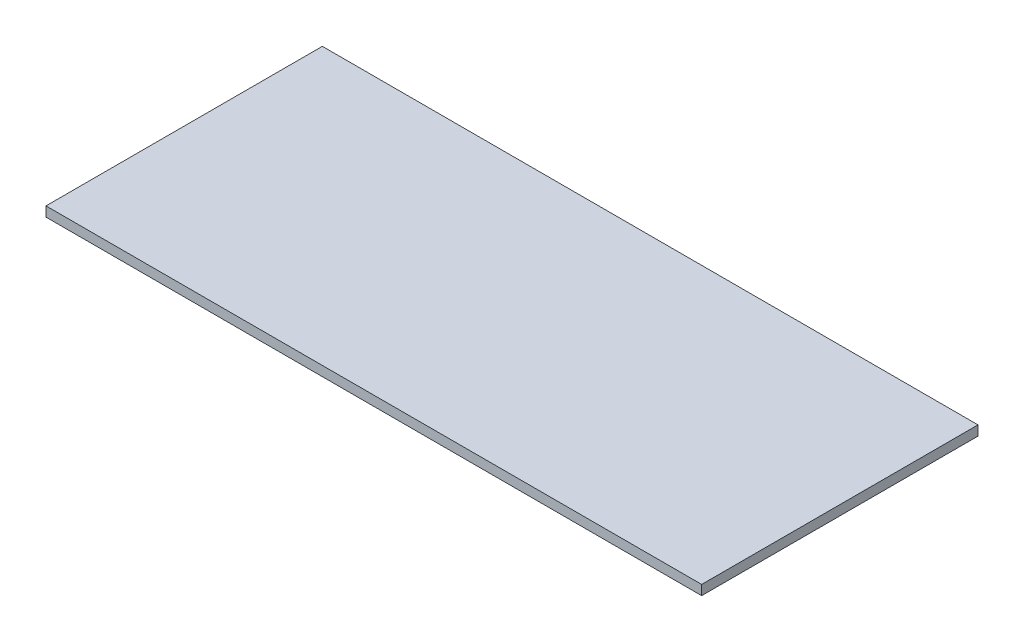
ISO-10303-21;
HEADER;
FILE_DESCRIPTION(('STEP AP214'),'2;1');
FILE_NAME('part.step','',(''),(''),'','','');
FILE_SCHEMA(('AUTOMOTIVE_DESIGN { 1 0 10303 214 1 1 1 1 }'));
ENDSEC;
DATA;
#1=APPLICATION_CONTEXT('core data for automotive mechanical design processes');
#2=APPLICATION_PROTOCOL_DEFINITION('international standard','automotive_design',2000,#1);
#3=PRODUCT_CONTEXT('',#1,'mechanical');
#4=PRODUCT('Part','Part','',(#3));
#5=PRODUCT_RELATED_PRODUCT_CATEGORY('part','',(#4));
#6=PRODUCT_DEFINITION_FORMATION('','',#4);
#7=PRODUCT_DEFINITION_CONTEXT('part definition',#1,'design');
#8=PRODUCT_DEFINITION('design','',#6,#7);
#9=PRODUCT_DEFINITION_SHAPE('','',#8);
#10=(LENGTH_UNIT() NAMED_UNIT(*) SI_UNIT(.MILLI.,.METRE.));
#11=(NAMED_UNIT(*) PLANE_ANGLE_UNIT() SI_UNIT($,.RADIAN.));
#12=(NAMED_UNIT(*) SI_UNIT($,.STERADIAN.) SOLID_ANGLE_UNIT());
#13=UNCERTAINTY_MEASURE_WITH_UNIT(LENGTH_MEASURE(1.E-05),#10,'distance_accuracy_value','');
#14=(GEOMETRIC_REPRESENTATION_CONTEXT(3) GLOBAL_UNCERTAINTY_ASSIGNED_CONTEXT((#13)) GLOBAL_UNIT_ASSIGNED_CONTEXT((#10,
#11,#12)) REPRESENTATION_CONTEXT('',''));
#15=CARTESIAN_POINT('',(0.,0.,0.));
#16=DIRECTION('',(0.,0.,1.));
#17=DIRECTION('',(1.,0.,0.));
#18=AXIS2_PLACEMENT_3D('',#15,#16,#17);
#19=CARTESIAN_POINT('',(-605.,18.,-255.));
#20=DIRECTION('',(0.,0.,-1.));
#21=DIRECTION('',(-1.,0.,0.));
#22=AXIS2_PLACEMENT_3D('',#19,#20,#21);
#23=PLANE('',#22);
#24=DIRECTION('',(1.,0.,0.));
#25=VECTOR('',#24,1.);
#26=CARTESIAN_POINT('',(-605.,0.,-255.));
#27=LINE('',#26,#25);
#28=CARTESIAN_POINT('',(-605.,0.,-255.));
#29=VERTEX_POINT('',#28);
#30=CARTESIAN_POINT('',(605.,0.,-255.));
#31=VERTEX_POINT('',#30);
#32=EDGE_CURVE('E97',#29,#31,#27,.T.);
#33=ORIENTED_EDGE('',*,*,#32,.F.);
#34=DIRECTION('',(0.,-1.,0.));
#35=VECTOR('',#34,1.);
#36=CARTESIAN_POINT('',(-605.,18.,-255.));
#37=LINE('',#36,#35);
#38=CARTESIAN_POINT('',(-605.,18.,-255.));
#39=VERTEX_POINT('',#38);
#40=EDGE_CURVE('E11',#39,#29,#37,.T.);
#41=ORIENTED_EDGE('',*,*,#40,.F.);
#42=DIRECTION('',(1.,0.,0.));
#43=VECTOR('',#42,1.);
#44=CARTESIAN_POINT('',(-605.,18.,-255.));
#45=LINE('',#44,#43);
#46=CARTESIAN_POINT('',(605.,18.,-255.));
#47=VERTEX_POINT('',#46);
#48=EDGE_CURVE('E92',#39,#47,#45,.T.);
#49=ORIENTED_EDGE('',*,*,#48,.T.);
#50=DIRECTION('',(0.,-1.,0.));
#51=VECTOR('',#50,1.);
#52=CARTESIAN_POINT('',(605.,18.,-255.));
#53=LINE('',#52,#51);
#54=EDGE_CURVE('E35',#47,#31,#53,.T.);
#55=ORIENTED_EDGE('',*,*,#54,.T.);
#56=EDGE_LOOP('',(#33,#41,#49,#55));
#57=FACE_BOUND('',#56,.T.);
#58=ADVANCED_FACE('F32',(#57),#23,.T.);
#59=CARTESIAN_POINT('',(-605.,18.,-255.));
#60=DIRECTION('',(1.,0.,0.));
#61=DIRECTION('',(0.,0.,-1.));
#62=AXIS2_PLACEMENT_3D('',#59,#60,#61);
#63=PLANE('',#62);
#64=DIRECTION('',(0.,0.,1.));
#65=VECTOR('',#64,1.);
#66=CARTESIAN_POINT('',(-605.,0.,-255.));
#67=LINE('',#66,#65);
#68=CARTESIAN_POINT('',(-605.,0.,255.));
#69=VERTEX_POINT('',#68);
#70=EDGE_CURVE('E65',#29,#69,#67,.T.);
#71=ORIENTED_EDGE('',*,*,#70,.T.);
#72=DIRECTION('',(0.,-1.,0.));
#73=VECTOR('',#72,1.);
#74=CARTESIAN_POINT('',(-605.,18.,255.));
#75=LINE('',#74,#73);
#76=CARTESIAN_POINT('',(-605.,18.,255.));
#77=VERTEX_POINT('',#76);
#78=EDGE_CURVE('E41',#77,#69,#75,.T.);
#79=ORIENTED_EDGE('',*,*,#78,.F.);
#80=DIRECTION('',(0.,0.,1.));
#81=VECTOR('',#80,1.);
#82=CARTESIAN_POINT('',(-605.,18.,-255.));
#83=LINE('',#82,#81);
#84=EDGE_CURVE('E82',#39,#77,#83,.T.);
#85=ORIENTED_EDGE('',*,*,#84,.F.);
#86=ORIENTED_EDGE('',*,*,#40,.T.);
#87=EDGE_LOOP('',(#71,#79,#85,#86));
#88=FACE_BOUND('',#87,.T.);
#89=ADVANCED_FACE('F107',(#88),#63,.F.);
#90=CARTESIAN_POINT('',(-605.,18.,255.));
#91=DIRECTION('',(0.,0.,-1.));
#92=DIRECTION('',(-1.,0.,0.));
#93=AXIS2_PLACEMENT_3D('',#90,#91,#92);
#94=PLANE('',#93);
#95=DIRECTION('',(1.,0.,0.));
#96=VECTOR('',#95,1.);
#97=CARTESIAN_POINT('',(-605.,0.,255.));
#98=LINE('',#97,#96);
#99=CARTESIAN_POINT('',(605.,0.,255.));
#100=VERTEX_POINT('',#99);
#101=EDGE_CURVE('E89',#69,#100,#98,.T.);
#102=ORIENTED_EDGE('',*,*,#101,.T.);
#103=DIRECTION('',(0.,-1.,0.));
#104=VECTOR('',#103,1.);
#105=CARTESIAN_POINT('',(605.,18.,255.));
#106=LINE('',#105,#104);
#107=CARTESIAN_POINT('',(605.,18.,255.));
#108=VERTEX_POINT('',#107);
#109=EDGE_CURVE('E86',#108,#100,#106,.T.);
#110=ORIENTED_EDGE('',*,*,#109,.F.);
#111=DIRECTION('',(1.,0.,0.));
#112=VECTOR('',#111,1.);
#113=CARTESIAN_POINT('',(-605.,18.,255.));
#114=LINE('',#113,#112);
#115=EDGE_CURVE('E77',#77,#108,#114,.T.);
#116=ORIENTED_EDGE('',*,*,#115,.F.);
#117=ORIENTED_EDGE('',*,*,#78,.T.);
#118=EDGE_LOOP('',(#102,#110,#116,#117));
#119=FACE_BOUND('',#118,.T.);
#120=ADVANCED_FACE('F87',(#119),#94,.F.);
#121=CARTESIAN_POINT('',(605.,18.,-255.));
#122=DIRECTION('',(1.,0.,0.));
#123=DIRECTION('',(0.,0.,-1.));
#124=AXIS2_PLACEMENT_3D('',#121,#122,#123);
#125=PLANE('',#124);
#126=DIRECTION('',(0.,0.,1.));
#127=VECTOR('',#126,1.);
#128=CARTESIAN_POINT('',(605.,0.,-255.));
#129=LINE('',#128,#127);
#130=EDGE_CURVE('E100',#31,#100,#129,.T.);
#131=ORIENTED_EDGE('',*,*,#130,.F.);
#132=ORIENTED_EDGE('',*,*,#54,.F.);
#133=DIRECTION('',(0.,0.,1.));
#134=VECTOR('',#133,1.);
#135=CARTESIAN_POINT('',(605.,18.,-255.));
#136=LINE('',#135,#134);
#137=EDGE_CURVE('E81',#47,#108,#136,.T.);
#138=ORIENTED_EDGE('',*,*,#137,.T.);
#139=ORIENTED_EDGE('',*,*,#109,.T.);
#140=EDGE_LOOP('',(#131,#132,#138,#139));
#141=FACE_BOUND('',#140,.T.);
#142=ADVANCED_FACE('F91',(#141),#125,.T.);
#143=CARTESIAN_POINT('',(0.,18.,0.));
#144=DIRECTION('',(0.,-1.,0.));
#145=DIRECTION('',(0.,0.,-1.));
#146=AXIS2_PLACEMENT_3D('',#143,#144,#145);
#147=PLANE('',#146);
#148=ORIENTED_EDGE('',*,*,#48,.F.);
#149=ORIENTED_EDGE('',*,*,#84,.T.);
#150=ORIENTED_EDGE('',*,*,#115,.T.);
#151=ORIENTED_EDGE('',*,*,#137,.F.);
#152=EDGE_LOOP('',(#148,#149,#150,#151));
#153=FACE_BOUND('',#152,.T.);
#154=ADVANCED_FACE('F80',(#153),#147,.F.);
#155=CARTESIAN_POINT('',(0.,0.,0.));
#156=DIRECTION('',(0.,-1.,0.));
#157=DIRECTION('',(0.,0.,-1.));
#158=AXIS2_PLACEMENT_3D('',#155,#156,#157);
#159=PLANE('',#158);
#160=ORIENTED_EDGE('',*,*,#32,.T.);
#161=ORIENTED_EDGE('',*,*,#130,.T.);
#162=ORIENTED_EDGE('',*,*,#101,.F.);
#163=ORIENTED_EDGE('',*,*,#70,.F.);
#164=EDGE_LOOP('',(#160,#161,#162,#163));
#165=FACE_BOUND('',#164,.T.);
#166=ADVANCED_FACE('F105',(#165),#159,.T.);
#167=CLOSED_SHELL('',(#58,#89,#120,#142,#154,#166));
#168=MANIFOLD_SOLID_BREP('B2',#167);
#169=ADVANCED_BREP_SHAPE_REPRESENTATION('',(#18,#168),#14);
#170=SHAPE_DEFINITION_REPRESENTATION(#9,#169);
ENDSEC;
END-ISO-10303-21;
